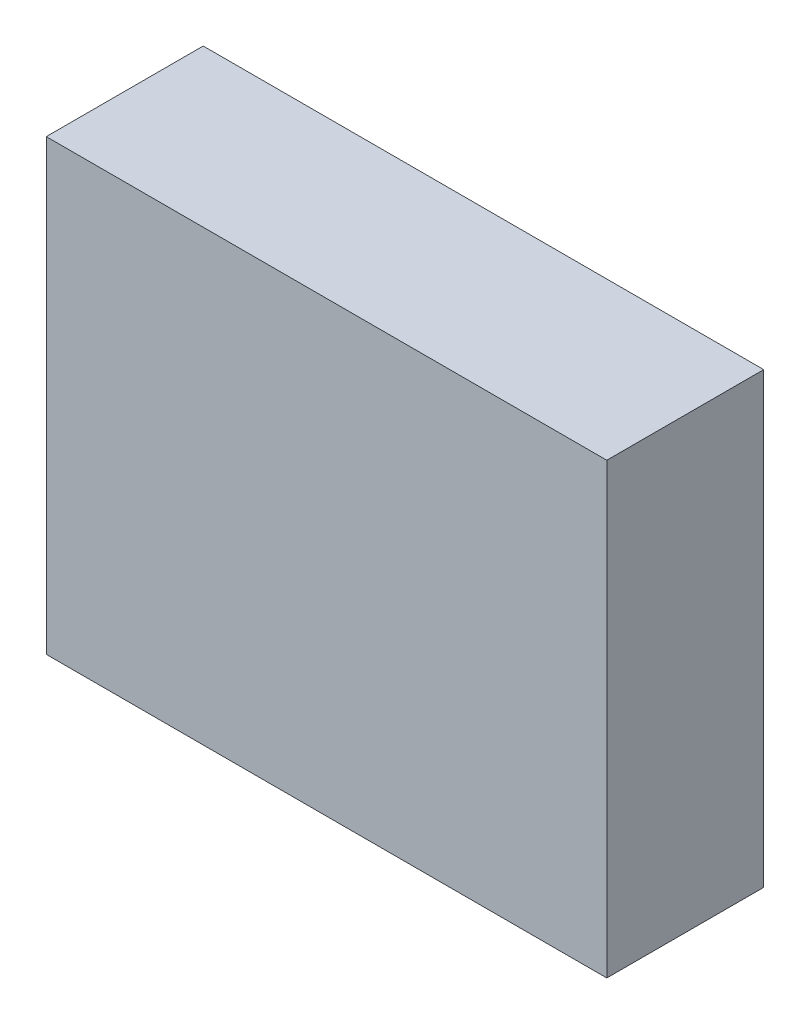
ISO-10303-21;
HEADER;
FILE_DESCRIPTION(('STEP AP214'),'2;1');
FILE_NAME('part.step','',(''),(''),'','','');
FILE_SCHEMA(('AUTOMOTIVE_DESIGN { 1 0 10303 214 1 1 1 1 }'));
ENDSEC;
DATA;
#1=APPLICATION_CONTEXT('core data for automotive mechanical design processes');
#2=APPLICATION_PROTOCOL_DEFINITION('international standard','automotive_design',2000,#1);
#3=PRODUCT_CONTEXT('',#1,'mechanical');
#4=PRODUCT('Part','Part','',(#3));
#5=PRODUCT_RELATED_PRODUCT_CATEGORY('part','',(#4));
#6=PRODUCT_DEFINITION_FORMATION('','',#4);
#7=PRODUCT_DEFINITION_CONTEXT('part definition',#1,'design');
#8=PRODUCT_DEFINITION('design','',#6,#7);
#9=PRODUCT_DEFINITION_SHAPE('','',#8);
#10=(LENGTH_UNIT() NAMED_UNIT(*) SI_UNIT(.MILLI.,.METRE.));
#11=(NAMED_UNIT(*) PLANE_ANGLE_UNIT() SI_UNIT($,.RADIAN.));
#12=(NAMED_UNIT(*) SI_UNIT($,.STERADIAN.) SOLID_ANGLE_UNIT());
#13=UNCERTAINTY_MEASURE_WITH_UNIT(LENGTH_MEASURE(1.E-05),#10,'distance_accuracy_value','');
#14=(GEOMETRIC_REPRESENTATION_CONTEXT(3) GLOBAL_UNCERTAINTY_ASSIGNED_CONTEXT((#13)) GLOBAL_UNIT_ASSIGNED_CONTEXT((#10,
#11,#12)) REPRESENTATION_CONTEXT('',''));
#15=CARTESIAN_POINT('',(0.,0.,0.));
#16=DIRECTION('',(0.,0.,1.));
#17=DIRECTION('',(1.,0.,0.));
#18=AXIS2_PLACEMENT_3D('',#15,#16,#17);
#19=CARTESIAN_POINT('',(0.,0.,0.));
#20=DIRECTION('',(-1.,0.,0.));
#21=DIRECTION('',(0.,0.,1.));
#22=AXIS2_PLACEMENT_3D('',#19,#20,#21);
#23=PLANE('',#22);
#24=DIRECTION('',(0.,-1.,0.));
#25=VECTOR('',#24,1.);
#26=CARTESIAN_POINT('',(0.,-4.,-1.4));
#27=LINE('',#26,#25);
#28=CARTESIAN_POINT('',(0.,0.,-1.4));
#29=VERTEX_POINT('',#28);
#30=CARTESIAN_POINT('',(0.,-4.,-1.4));
#31=VERTEX_POINT('',#30);
#32=EDGE_CURVE('E77',#29,#31,#27,.T.);
#33=ORIENTED_EDGE('',*,*,#32,.T.);
#34=DIRECTION('',(0.,0.,-1.));
#35=VECTOR('',#34,1.);
#36=CARTESIAN_POINT('',(0.,-4.,0.));
#37=LINE('',#36,#35);
#38=CARTESIAN_POINT('',(0.,-4.,0.));
#39=VERTEX_POINT('',#38);
#40=EDGE_CURVE('E11',#39,#31,#37,.T.);
#41=ORIENTED_EDGE('',*,*,#40,.F.);
#42=DIRECTION('',(0.,1.,0.));
#43=VECTOR('',#42,1.);
#44=CARTESIAN_POINT('',(0.,-4.,0.));
#45=LINE('',#44,#43);
#46=CARTESIAN_POINT('',(0.,0.,0.));
#47=VERTEX_POINT('',#46);
#48=EDGE_CURVE('E79',#39,#47,#45,.T.);
#49=ORIENTED_EDGE('',*,*,#48,.T.);
#50=DIRECTION('',(0.,0.,-1.));
#51=VECTOR('',#50,1.);
#52=CARTESIAN_POINT('',(0.,0.,0.));
#53=LINE('',#52,#51);
#54=EDGE_CURVE('E56',#47,#29,#53,.T.);
#55=ORIENTED_EDGE('',*,*,#54,.T.);
#56=EDGE_LOOP('',(#33,#41,#49,#55));
#57=FACE_BOUND('',#56,.T.);
#58=ADVANCED_FACE('F16',(#57),#23,.T.);
#59=CARTESIAN_POINT('',(0.,-4.,0.));
#60=DIRECTION('',(0.,-1.,0.));
#61=DIRECTION('',(0.,0.,-1.));
#62=AXIS2_PLACEMENT_3D('',#59,#60,#61);
#63=PLANE('',#62);
#64=DIRECTION('',(1.,0.,0.));
#65=VECTOR('',#64,1.);
#66=CARTESIAN_POINT('',(5.,-4.,-1.4));
#67=LINE('',#66,#65);
#68=CARTESIAN_POINT('',(5.,-4.,-1.4));
#69=VERTEX_POINT('',#68);
#70=EDGE_CURVE('E93',#31,#69,#67,.T.);
#71=ORIENTED_EDGE('',*,*,#70,.T.);
#72=DIRECTION('',(0.,0.,-1.));
#73=VECTOR('',#72,1.);
#74=CARTESIAN_POINT('',(5.,-4.,0.));
#75=LINE('',#74,#73);
#76=CARTESIAN_POINT('',(5.,-4.,0.));
#77=VERTEX_POINT('',#76);
#78=EDGE_CURVE('E20',#77,#69,#75,.T.);
#79=ORIENTED_EDGE('',*,*,#78,.F.);
#80=DIRECTION('',(-1.,0.,0.));
#81=VECTOR('',#80,1.);
#82=CARTESIAN_POINT('',(5.,-4.,0.));
#83=LINE('',#82,#81);
#84=EDGE_CURVE('E102',#77,#39,#83,.T.);
#85=ORIENTED_EDGE('',*,*,#84,.T.);
#86=ORIENTED_EDGE('',*,*,#40,.T.);
#87=EDGE_LOOP('',(#71,#79,#85,#86));
#88=FACE_BOUND('',#87,.T.);
#89=ADVANCED_FACE('F130',(#88),#63,.T.);
#90=CARTESIAN_POINT('',(5.,-4.,0.));
#91=DIRECTION('',(1.,0.,0.));
#92=DIRECTION('',(0.,1.,0.));
#93=AXIS2_PLACEMENT_3D('',#90,#91,#92);
#94=PLANE('',#93);
#95=DIRECTION('',(0.,1.,0.));
#96=VECTOR('',#95,1.);
#97=CARTESIAN_POINT('',(5.,0.,-1.4));
#98=LINE('',#97,#96);
#99=CARTESIAN_POINT('',(5.,0.,-1.4));
#100=VERTEX_POINT('',#99);
#101=EDGE_CURVE('E91',#69,#100,#98,.T.);
#102=ORIENTED_EDGE('',*,*,#101,.T.);
#103=DIRECTION('',(0.,0.,-1.));
#104=VECTOR('',#103,1.);
#105=CARTESIAN_POINT('',(5.,0.,0.));
#106=LINE('',#105,#104);
#107=CARTESIAN_POINT('',(5.,0.,0.));
#108=VERTEX_POINT('',#107);
#109=EDGE_CURVE('E82',#108,#100,#106,.T.);
#110=ORIENTED_EDGE('',*,*,#109,.F.);
#111=DIRECTION('',(0.,-1.,0.));
#112=VECTOR('',#111,1.);
#113=CARTESIAN_POINT('',(5.,0.,0.));
#114=LINE('',#113,#112);
#115=EDGE_CURVE('E83',#108,#77,#114,.T.);
#116=ORIENTED_EDGE('',*,*,#115,.T.);
#117=ORIENTED_EDGE('',*,*,#78,.T.);
#118=EDGE_LOOP('',(#102,#110,#116,#117));
#119=FACE_BOUND('',#118,.T.);
#120=ADVANCED_FACE('F127',(#119),#94,.T.);
#121=CARTESIAN_POINT('',(5.,0.,0.));
#122=DIRECTION('',(0.,1.,0.));
#123=DIRECTION('',(1.,0.,0.));
#124=AXIS2_PLACEMENT_3D('',#121,#122,#123);
#125=PLANE('',#124);
#126=DIRECTION('',(-1.,0.,0.));
#127=VECTOR('',#126,1.);
#128=CARTESIAN_POINT('',(0.,0.,-1.4));
#129=LINE('',#128,#127);
#130=EDGE_CURVE('E86',#100,#29,#129,.T.);
#131=ORIENTED_EDGE('',*,*,#130,.T.);
#132=ORIENTED_EDGE('',*,*,#54,.F.);
#133=DIRECTION('',(1.,0.,0.));
#134=VECTOR('',#133,1.);
#135=CARTESIAN_POINT('',(0.,0.,0.));
#136=LINE('',#135,#134);
#137=EDGE_CURVE('E103',#47,#108,#136,.T.);
#138=ORIENTED_EDGE('',*,*,#137,.T.);
#139=ORIENTED_EDGE('',*,*,#109,.T.);
#140=EDGE_LOOP('',(#131,#132,#138,#139));
#141=FACE_BOUND('',#140,.T.);
#142=ADVANCED_FACE('F87',(#141),#125,.T.);
#143=CARTESIAN_POINT('',(2.5,-2.,0.));
#144=DIRECTION('',(0.,0.,1.));
#145=DIRECTION('',(1.,0.,0.));
#146=AXIS2_PLACEMENT_3D('',#143,#144,#145);
#147=PLANE('',#146);
#148=ORIENTED_EDGE('',*,*,#137,.F.);
#149=ORIENTED_EDGE('',*,*,#48,.F.);
#150=ORIENTED_EDGE('',*,*,#84,.F.);
#151=ORIENTED_EDGE('',*,*,#115,.F.);
#152=EDGE_LOOP('',(#148,#149,#150,#151));
#153=FACE_BOUND('',#152,.T.);
#154=ADVANCED_FACE('F119',(#153),#147,.T.);
#155=CARTESIAN_POINT('',(2.5,-2.,-1.4));
#156=DIRECTION('',(0.,0.,1.));
#157=DIRECTION('',(1.,0.,0.));
#158=AXIS2_PLACEMENT_3D('',#155,#156,#157);
#159=PLANE('',#158);
#160=ORIENTED_EDGE('',*,*,#32,.F.);
#161=ORIENTED_EDGE('',*,*,#130,.F.);
#162=ORIENTED_EDGE('',*,*,#101,.F.);
#163=ORIENTED_EDGE('',*,*,#70,.F.);
#164=EDGE_LOOP('',(#160,#161,#162,#163));
#165=FACE_BOUND('',#164,.T.);
#166=ADVANCED_FACE('F18',(#165),#159,.F.);
#167=CLOSED_SHELL('',(#58,#89,#120,#142,#154,#166));
#168=MANIFOLD_SOLID_BREP('B1',#167);
#169=ADVANCED_BREP_SHAPE_REPRESENTATION('',(#18,#168),#14);
#170=SHAPE_DEFINITION_REPRESENTATION(#9,#169);
ENDSEC;
END-ISO-10303-21;
